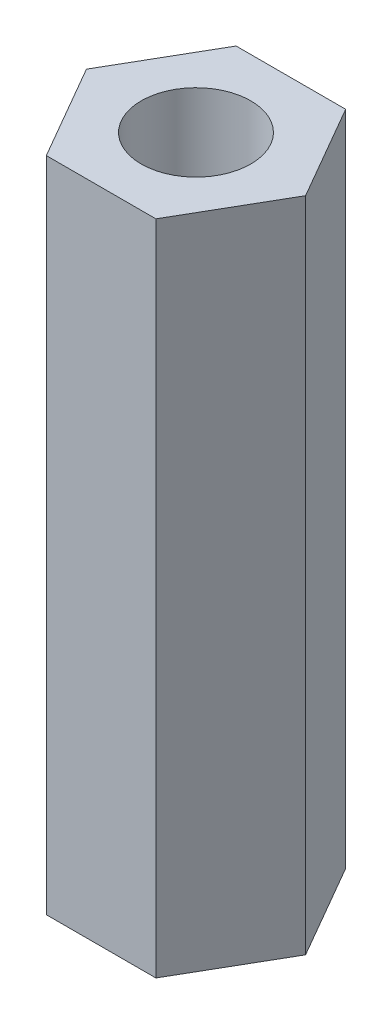
ISO-10303-21;
HEADER;
FILE_DESCRIPTION(('STEP AP214'),'2;1');
FILE_NAME('part.step','',(''),(''),'','','');
FILE_SCHEMA(('AUTOMOTIVE_DESIGN { 1 0 10303 214 1 1 1 1 }'));
ENDSEC;
DATA;
#1=APPLICATION_CONTEXT('core data for automotive mechanical design processes');
#2=APPLICATION_PROTOCOL_DEFINITION('international standard','automotive_design',2000,#1);
#3=PRODUCT_CONTEXT('',#1,'mechanical');
#4=PRODUCT('Part','Part','',(#3));
#5=PRODUCT_RELATED_PRODUCT_CATEGORY('part','',(#4));
#6=PRODUCT_DEFINITION_FORMATION('','',#4);
#7=PRODUCT_DEFINITION_CONTEXT('part definition',#1,'design');
#8=PRODUCT_DEFINITION('design','',#6,#7);
#9=PRODUCT_DEFINITION_SHAPE('','',#8);
#10=(LENGTH_UNIT() NAMED_UNIT(*) SI_UNIT(.MILLI.,.METRE.));
#11=(NAMED_UNIT(*) PLANE_ANGLE_UNIT() SI_UNIT($,.RADIAN.));
#12=(NAMED_UNIT(*) SI_UNIT($,.STERADIAN.) SOLID_ANGLE_UNIT());
#13=UNCERTAINTY_MEASURE_WITH_UNIT(LENGTH_MEASURE(1.E-05),#10,'distance_accuracy_value','');
#14=(GEOMETRIC_REPRESENTATION_CONTEXT(3) GLOBAL_UNCERTAINTY_ASSIGNED_CONTEXT((#13)) GLOBAL_UNIT_ASSIGNED_CONTEXT((#10,
#11,#12)) REPRESENTATION_CONTEXT('',''));
#15=CARTESIAN_POINT('',(0.,0.,0.));
#16=DIRECTION('',(0.,0.,1.));
#17=DIRECTION('',(1.,0.,0.));
#18=AXIS2_PLACEMENT_3D('',#15,#16,#17);
#19=CARTESIAN_POINT('',(0.,30.,0.));
#20=DIRECTION('',(0.,1.,0.));
#21=DIRECTION('',(0.,0.,1.));
#22=AXIS2_PLACEMENT_3D('',#19,#20,#21);
#23=PLANE('',#22);
#24=DIRECTION('',(0.5,0.,-0.866025403784439));
#25=VECTOR('',#24,1.);
#26=CARTESIAN_POINT('',(2.5,30.,4.33012701892219));
#27=LINE('',#26,#25);
#28=CARTESIAN_POINT('',(2.5,30.,4.33012701892219));
#29=VERTEX_POINT('',#28);
#30=CARTESIAN_POINT('',(5.,30.,0.));
#31=VERTEX_POINT('',#30);
#32=EDGE_CURVE('E150',#29,#31,#27,.T.);
#33=ORIENTED_EDGE('',*,*,#32,.T.);
#34=DIRECTION('',(-0.5,0.,-0.866025403784439));
#35=VECTOR('',#34,1.);
#36=CARTESIAN_POINT('',(5.,30.,0.));
#37=LINE('',#36,#35);
#38=CARTESIAN_POINT('',(2.5,30.,-4.33012701892219));
#39=VERTEX_POINT('',#38);
#40=EDGE_CURVE('E98',#31,#39,#37,.T.);
#41=ORIENTED_EDGE('',*,*,#40,.T.);
#42=DIRECTION('',(-1.,0.,0.));
#43=VECTOR('',#42,1.);
#44=CARTESIAN_POINT('',(2.5,30.,-4.33012701892219));
#45=LINE('',#44,#43);
#46=CARTESIAN_POINT('',(-2.5,30.,-4.3301270189222));
#47=VERTEX_POINT('',#46);
#48=EDGE_CURVE('E111',#39,#47,#45,.T.);
#49=ORIENTED_EDGE('',*,*,#48,.T.);
#50=DIRECTION('',(-0.5,0.,0.866025403784439));
#51=VECTOR('',#50,1.);
#52=CARTESIAN_POINT('',(-2.5,30.,-4.3301270189222));
#53=LINE('',#52,#51);
#54=CARTESIAN_POINT('',(-5.,30.,0.));
#55=VERTEX_POINT('',#54);
#56=EDGE_CURVE('E105',#47,#55,#53,.T.);
#57=ORIENTED_EDGE('',*,*,#56,.T.);
#58=DIRECTION('',(0.5,0.,0.866025403784438));
#59=VECTOR('',#58,1.);
#60=CARTESIAN_POINT('',(-5.,30.,0.));
#61=LINE('',#60,#59);
#62=CARTESIAN_POINT('',(-2.5,30.,4.33012701892219));
#63=VERTEX_POINT('',#62);
#64=EDGE_CURVE('E109',#55,#63,#61,.T.);
#65=ORIENTED_EDGE('',*,*,#64,.T.);
#66=DIRECTION('',(1.,0.,0.));
#67=VECTOR('',#66,1.);
#68=CARTESIAN_POINT('',(-2.5,30.,4.33012701892219));
#69=LINE('',#68,#67);
#70=EDGE_CURVE('E61',#63,#29,#69,.T.);
#71=ORIENTED_EDGE('',*,*,#70,.T.);
#72=EDGE_LOOP('',(#33,#41,#49,#57,#65,#71));
#73=FACE_BOUND('',#72,.T.);
#74=CARTESIAN_POINT('',(0.,30.,0.));
#75=DIRECTION('',(0.,1.,0.));
#76=DIRECTION('',(0.,0.,1.));
#77=AXIS2_PLACEMENT_3D('',#74,#75,#76);
#78=CIRCLE('',#77,2.5);
#79=CARTESIAN_POINT('',(0.,30.,2.5));
#80=VERTEX_POINT('',#79);
#81=EDGE_CURVE('E138',#80,#80,#78,.T.);
#82=ORIENTED_EDGE('',*,*,#81,.F.);
#83=EDGE_LOOP('',(#82));
#84=FACE_BOUND('',#83,.T.);
#85=ADVANCED_FACE('F43',(#73,#84),#23,.T.);
#86=CARTESIAN_POINT('',(0.,0.,0.));
#87=DIRECTION('',(0.,1.,0.));
#88=DIRECTION('',(0.,0.,1.));
#89=AXIS2_PLACEMENT_3D('',#86,#87,#88);
#90=PLANE('',#89);
#91=DIRECTION('',(0.5,0.,-0.866025403784439));
#92=VECTOR('',#91,1.);
#93=CARTESIAN_POINT('',(2.5,0.,4.33012701892219));
#94=LINE('',#93,#92);
#95=CARTESIAN_POINT('',(2.5,0.,4.33012701892219));
#96=VERTEX_POINT('',#95);
#97=CARTESIAN_POINT('',(5.,0.,0.));
#98=VERTEX_POINT('',#97);
#99=EDGE_CURVE('E133',#96,#98,#94,.T.);
#100=ORIENTED_EDGE('',*,*,#99,.F.);
#101=DIRECTION('',(1.,0.,0.));
#102=VECTOR('',#101,1.);
#103=CARTESIAN_POINT('',(-2.5,0.,4.33012701892219));
#104=LINE('',#103,#102);
#105=CARTESIAN_POINT('',(-2.5,0.,4.33012701892219));
#106=VERTEX_POINT('',#105);
#107=EDGE_CURVE('E90',#106,#96,#104,.T.);
#108=ORIENTED_EDGE('',*,*,#107,.F.);
#109=DIRECTION('',(0.5,0.,0.866025403784438));
#110=VECTOR('',#109,1.);
#111=CARTESIAN_POINT('',(-5.,0.,0.));
#112=LINE('',#111,#110);
#113=CARTESIAN_POINT('',(-5.,0.,0.));
#114=VERTEX_POINT('',#113);
#115=EDGE_CURVE('E84',#114,#106,#112,.T.);
#116=ORIENTED_EDGE('',*,*,#115,.F.);
#117=DIRECTION('',(-0.5,0.,0.866025403784439));
#118=VECTOR('',#117,1.);
#119=CARTESIAN_POINT('',(-2.5,0.,-4.3301270189222));
#120=LINE('',#119,#118);
#121=CARTESIAN_POINT('',(-2.5,0.,-4.3301270189222));
#122=VERTEX_POINT('',#121);
#123=EDGE_CURVE('E120',#122,#114,#120,.T.);
#124=ORIENTED_EDGE('',*,*,#123,.F.);
#125=DIRECTION('',(-1.,0.,0.));
#126=VECTOR('',#125,1.);
#127=CARTESIAN_POINT('',(2.5,0.,-4.33012701892219));
#128=LINE('',#127,#126);
#129=CARTESIAN_POINT('',(2.5,0.,-4.33012701892219));
#130=VERTEX_POINT('',#129);
#131=EDGE_CURVE('E141',#130,#122,#128,.T.);
#132=ORIENTED_EDGE('',*,*,#131,.F.);
#133=DIRECTION('',(-0.5,0.,-0.866025403784439));
#134=VECTOR('',#133,1.);
#135=CARTESIAN_POINT('',(5.,0.,0.));
#136=LINE('',#135,#134);
#137=EDGE_CURVE('E137',#98,#130,#136,.T.);
#138=ORIENTED_EDGE('',*,*,#137,.F.);
#139=EDGE_LOOP('',(#100,#108,#116,#124,#132,#138));
#140=FACE_BOUND('',#139,.T.);
#141=CARTESIAN_POINT('',(0.,0.,0.));
#142=DIRECTION('',(0.,1.,0.));
#143=DIRECTION('',(0.,0.,1.));
#144=AXIS2_PLACEMENT_3D('',#141,#142,#143);
#145=CIRCLE('',#144,2.5);
#146=CARTESIAN_POINT('',(0.,0.,2.5));
#147=VERTEX_POINT('',#146);
#148=EDGE_CURVE('E265',#147,#147,#145,.T.);
#149=ORIENTED_EDGE('',*,*,#148,.T.);
#150=EDGE_LOOP('',(#149));
#151=FACE_BOUND('',#150,.T.);
#152=ADVANCED_FACE('F163',(#140,#151),#90,.F.);
#153=CARTESIAN_POINT('',(2.5,30.,4.33012701892219));
#154=DIRECTION('',(-0.866025403784439,0.,-0.5));
#155=DIRECTION('',(-0.5,0.,0.866025403784439));
#156=AXIS2_PLACEMENT_3D('',#153,#154,#155);
#157=PLANE('',#156);
#158=ORIENTED_EDGE('',*,*,#99,.T.);
#159=DIRECTION('',(0.,-1.,0.));
#160=VECTOR('',#159,1.);
#161=CARTESIAN_POINT('',(5.,30.,0.));
#162=LINE('',#161,#160);
#163=EDGE_CURVE('E11',#31,#98,#162,.T.);
#164=ORIENTED_EDGE('',*,*,#163,.F.);
#165=ORIENTED_EDGE('',*,*,#32,.F.);
#166=DIRECTION('',(0.,-1.,0.));
#167=VECTOR('',#166,1.);
#168=CARTESIAN_POINT('',(2.5,30.,4.33012701892219));
#169=LINE('',#168,#167);
#170=EDGE_CURVE('E129',#29,#96,#169,.T.);
#171=ORIENTED_EDGE('',*,*,#170,.T.);
#172=EDGE_LOOP('',(#158,#164,#165,#171));
#173=FACE_BOUND('',#172,.T.);
#174=ADVANCED_FACE('F45',(#173),#157,.F.);
#175=CARTESIAN_POINT('',(5.,30.,0.));
#176=DIRECTION('',(-0.866025403784439,0.,0.5));
#177=DIRECTION('',(0.5,0.,0.866025403784439));
#178=AXIS2_PLACEMENT_3D('',#175,#176,#177);
#179=PLANE('',#178);
#180=ORIENTED_EDGE('',*,*,#137,.T.);
#181=DIRECTION('',(0.,-1.,0.));
#182=VECTOR('',#181,1.);
#183=CARTESIAN_POINT('',(2.5,30.,-4.33012701892219));
#184=LINE('',#183,#182);
#185=EDGE_CURVE('E53',#39,#130,#184,.T.);
#186=ORIENTED_EDGE('',*,*,#185,.F.);
#187=ORIENTED_EDGE('',*,*,#40,.F.);
#188=ORIENTED_EDGE('',*,*,#163,.T.);
#189=EDGE_LOOP('',(#180,#186,#187,#188));
#190=FACE_BOUND('',#189,.T.);
#191=ADVANCED_FACE('F188',(#190),#179,.F.);
#192=CARTESIAN_POINT('',(2.5,30.,-4.33012701892219));
#193=DIRECTION('',(0.,0.,1.));
#194=DIRECTION('',(1.,0.,0.));
#195=AXIS2_PLACEMENT_3D('',#192,#193,#194);
#196=PLANE('',#195);
#197=ORIENTED_EDGE('',*,*,#131,.T.);
#198=DIRECTION('',(0.,-1.,0.));
#199=VECTOR('',#198,1.);
#200=CARTESIAN_POINT('',(-2.5,30.,-4.3301270189222));
#201=LINE('',#200,#199);
#202=EDGE_CURVE('E122',#47,#122,#201,.T.);
#203=ORIENTED_EDGE('',*,*,#202,.F.);
#204=ORIENTED_EDGE('',*,*,#48,.F.);
#205=ORIENTED_EDGE('',*,*,#185,.T.);
#206=EDGE_LOOP('',(#197,#203,#204,#205));
#207=FACE_BOUND('',#206,.T.);
#208=ADVANCED_FACE('F160',(#207),#196,.F.);
#209=CARTESIAN_POINT('',(-2.5,30.,-4.3301270189222));
#210=DIRECTION('',(0.866025403784438,0.,0.5));
#211=DIRECTION('',(0.5,0.,-0.866025403784439));
#212=AXIS2_PLACEMENT_3D('',#209,#210,#211);
#213=PLANE('',#212);
#214=ORIENTED_EDGE('',*,*,#123,.T.);
#215=DIRECTION('',(0.,-1.,0.));
#216=VECTOR('',#215,1.);
#217=CARTESIAN_POINT('',(-5.,30.,0.));
#218=LINE('',#217,#216);
#219=EDGE_CURVE('E117',#55,#114,#218,.T.);
#220=ORIENTED_EDGE('',*,*,#219,.F.);
#221=ORIENTED_EDGE('',*,*,#56,.F.);
#222=ORIENTED_EDGE('',*,*,#202,.T.);
#223=EDGE_LOOP('',(#214,#220,#221,#222));
#224=FACE_BOUND('',#223,.T.);
#225=ADVANCED_FACE('F118',(#224),#213,.F.);
#226=CARTESIAN_POINT('',(-5.,30.,0.));
#227=DIRECTION('',(0.866025403784438,0.,-0.5));
#228=DIRECTION('',(-0.5,0.,-0.866025403784439));
#229=AXIS2_PLACEMENT_3D('',#226,#227,#228);
#230=PLANE('',#229);
#231=ORIENTED_EDGE('',*,*,#115,.T.);
#232=DIRECTION('',(0.,-1.,0.));
#233=VECTOR('',#232,1.);
#234=CARTESIAN_POINT('',(-2.5,30.,4.33012701892219));
#235=LINE('',#234,#233);
#236=EDGE_CURVE('E123',#63,#106,#235,.T.);
#237=ORIENTED_EDGE('',*,*,#236,.F.);
#238=ORIENTED_EDGE('',*,*,#64,.F.);
#239=ORIENTED_EDGE('',*,*,#219,.T.);
#240=EDGE_LOOP('',(#231,#237,#238,#239));
#241=FACE_BOUND('',#240,.T.);
#242=ADVANCED_FACE('F125',(#241),#230,.F.);
#243=CARTESIAN_POINT('',(-2.5,30.,4.33012701892219));
#244=DIRECTION('',(0.,0.,-1.));
#245=DIRECTION('',(-1.,0.,0.));
#246=AXIS2_PLACEMENT_3D('',#243,#244,#245);
#247=PLANE('',#246);
#248=ORIENTED_EDGE('',*,*,#107,.T.);
#249=ORIENTED_EDGE('',*,*,#170,.F.);
#250=ORIENTED_EDGE('',*,*,#70,.F.);
#251=ORIENTED_EDGE('',*,*,#236,.T.);
#252=EDGE_LOOP('',(#248,#249,#250,#251));
#253=FACE_BOUND('',#252,.T.);
#254=ADVANCED_FACE('F168',(#253),#247,.F.);
#255=CARTESIAN_POINT('',(0.,30.,0.));
#256=DIRECTION('',(0.,-1.,0.));
#257=DIRECTION('',(0.,0.,-1.));
#258=AXIS2_PLACEMENT_3D('',#255,#256,#257);
#259=CYLINDRICAL_SURFACE('',#258,2.5);
#260=ORIENTED_EDGE('',*,*,#81,.T.);
#261=EDGE_LOOP('',(#260));
#262=FACE_BOUND('',#261,.T.);
#263=ORIENTED_EDGE('',*,*,#148,.F.);
#264=EDGE_LOOP('',(#263));
#265=FACE_BOUND('',#264,.T.);
#266=ADVANCED_FACE('F170',(#262,#265),#259,.F.);
#267=CLOSED_SHELL('',(#85,#152,#174,#191,#208,#225,#242,#254,#266));
#268=MANIFOLD_SOLID_BREP('B2',#267);
#269=ADVANCED_BREP_SHAPE_REPRESENTATION('',(#18,#268),#14);
#270=SHAPE_DEFINITION_REPRESENTATION(#9,#269);
ENDSEC;
END-ISO-10303-21;
